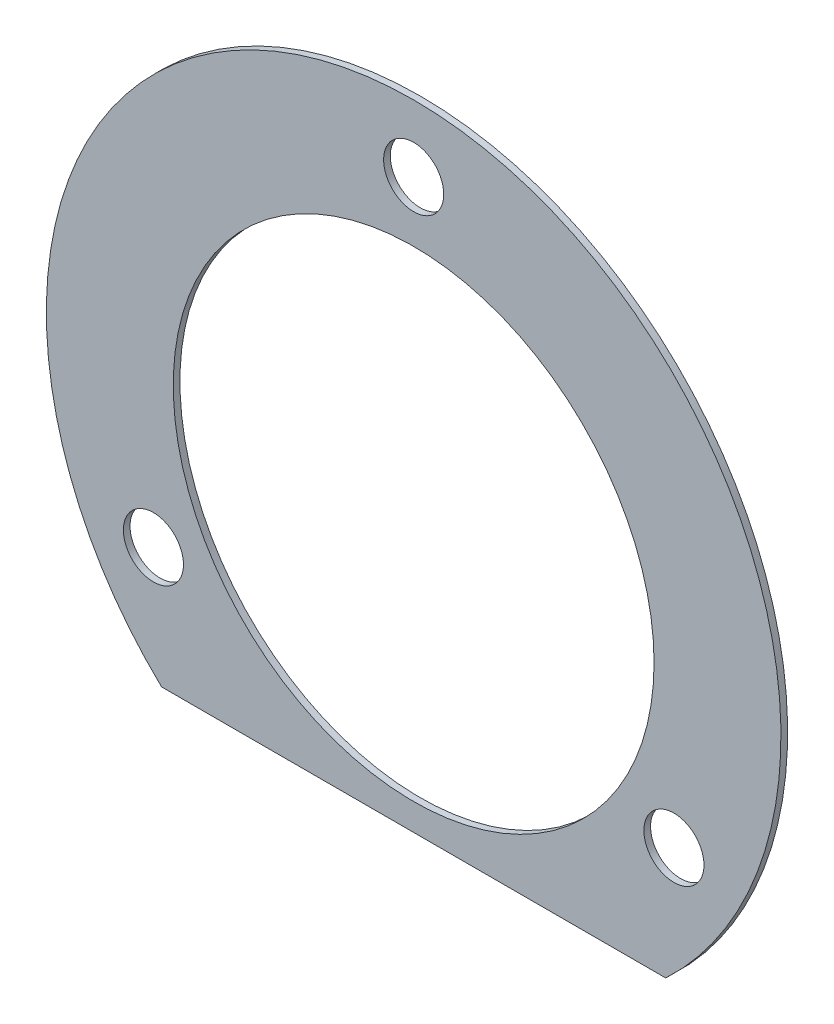
ISO-10303-21;
HEADER;
FILE_DESCRIPTION(('STEP AP214'),'2;1');
FILE_NAME('part.step','',(''),(''),'','','');
FILE_SCHEMA(('AUTOMOTIVE_DESIGN { 1 0 10303 214 1 1 1 1 }'));
ENDSEC;
DATA;
#1=APPLICATION_CONTEXT('core data for automotive mechanical design processes');
#2=APPLICATION_PROTOCOL_DEFINITION('international standard','automotive_design',2000,#1);
#3=PRODUCT_CONTEXT('',#1,'mechanical');
#4=PRODUCT('Part','Part','',(#3));
#5=PRODUCT_RELATED_PRODUCT_CATEGORY('part','',(#4));
#6=PRODUCT_DEFINITION_FORMATION('','',#4);
#7=PRODUCT_DEFINITION_CONTEXT('part definition',#1,'design');
#8=PRODUCT_DEFINITION('design','',#6,#7);
#9=PRODUCT_DEFINITION_SHAPE('','',#8);
#10=(LENGTH_UNIT() NAMED_UNIT(*) SI_UNIT(.MILLI.,.METRE.));
#11=(NAMED_UNIT(*) PLANE_ANGLE_UNIT() SI_UNIT($,.RADIAN.));
#12=(NAMED_UNIT(*) SI_UNIT($,.STERADIAN.) SOLID_ANGLE_UNIT());
#13=UNCERTAINTY_MEASURE_WITH_UNIT(LENGTH_MEASURE(1.E-05),#10,'distance_accuracy_value','');
#14=(GEOMETRIC_REPRESENTATION_CONTEXT(3) GLOBAL_UNCERTAINTY_ASSIGNED_CONTEXT((#13)) GLOBAL_UNIT_ASSIGNED_CONTEXT((#10,
#11,#12)) REPRESENTATION_CONTEXT('',''));
#15=CARTESIAN_POINT('',(0.,0.,0.));
#16=DIRECTION('',(0.,0.,1.));
#17=DIRECTION('',(1.,0.,0.));
#18=AXIS2_PLACEMENT_3D('',#15,#16,#17);
#19=CARTESIAN_POINT('',(0.,0.,1.));
#20=DIRECTION('',(0.,0.,1.));
#21=DIRECTION('',(1.,0.,0.));
#22=AXIS2_PLACEMENT_3D('',#19,#20,#21);
#23=PLANE('',#22);
#24=DIRECTION('',(1.,0.,0.));
#25=VECTOR('',#24,1.);
#26=CARTESIAN_POINT('',(37.7491721763537,-40.,1.));
#27=LINE('',#26,#25);
#28=CARTESIAN_POINT('',(-37.7491721763537,-40.,1.));
#29=VERTEX_POINT('',#28);
#30=CARTESIAN_POINT('',(37.7491721763537,-40.,1.));
#31=VERTEX_POINT('',#30);
#32=EDGE_CURVE('E56',#29,#31,#27,.T.);
#33=ORIENTED_EDGE('',*,*,#32,.T.);
#34=CARTESIAN_POINT('',(0.,0.,1.));
#35=DIRECTION('',(0.,0.,1.));
#36=DIRECTION('',(1.,0.,0.));
#37=AXIS2_PLACEMENT_3D('',#34,#35,#36);
#38=CIRCLE('',#37,55.);
#39=EDGE_CURVE('E12',#31,#29,#38,.T.);
#40=ORIENTED_EDGE('',*,*,#39,.T.);
#41=EDGE_LOOP('',(#33,#40));
#42=FACE_BOUND('',#41,.T.);
#43=CARTESIAN_POINT('',(0.,45.,1.));
#44=DIRECTION('',(0.,0.,1.));
#45=DIRECTION('',(1.,0.,0.));
#46=AXIS2_PLACEMENT_3D('',#43,#44,#45);
#47=CIRCLE('',#46,4.50000000000001);
#48=CARTESIAN_POINT('',(4.50000000000001,45.,1.));
#49=VERTEX_POINT('',#48);
#50=EDGE_CURVE('E109',#49,#49,#47,.T.);
#51=ORIENTED_EDGE('',*,*,#50,.F.);
#52=EDGE_LOOP('',(#51));
#53=FACE_BOUND('',#52,.T.);
#54=CARTESIAN_POINT('',(38.9711431702997,-22.4999999999983,1.));
#55=DIRECTION('',(0.,0.,1.));
#56=DIRECTION('',(1.,0.,0.));
#57=AXIS2_PLACEMENT_3D('',#54,#55,#56);
#58=CIRCLE('',#57,4.50000000000186);
#59=CARTESIAN_POINT('',(43.4711431703016,-22.4999999999983,1.));
#60=VERTEX_POINT('',#59);
#61=EDGE_CURVE('E101',#60,#60,#58,.T.);
#62=ORIENTED_EDGE('',*,*,#61,.F.);
#63=EDGE_LOOP('',(#62));
#64=FACE_BOUND('',#63,.T.);
#65=CARTESIAN_POINT('',(-38.9711431702983,-22.4999999999992,1.));
#66=DIRECTION('',(0.,0.,1.));
#67=DIRECTION('',(1.,0.,0.));
#68=AXIS2_PLACEMENT_3D('',#65,#66,#67);
#69=CIRCLE('',#68,4.50000000000094);
#70=CARTESIAN_POINT('',(-34.4711431702973,-22.4999999999992,1.));
#71=VERTEX_POINT('',#70);
#72=EDGE_CURVE('E72',#71,#71,#69,.T.);
#73=ORIENTED_EDGE('',*,*,#72,.F.);
#74=EDGE_LOOP('',(#73));
#75=FACE_BOUND('',#74,.T.);
#76=CARTESIAN_POINT('',(0.,0.,1.));
#77=DIRECTION('',(0.,0.,1.));
#78=DIRECTION('',(1.,0.,0.));
#79=AXIS2_PLACEMENT_3D('',#76,#77,#78);
#80=CIRCLE('',#79,36.);
#81=CARTESIAN_POINT('',(36.,0.,1.));
#82=VERTEX_POINT('',#81);
#83=EDGE_CURVE('E82',#82,#82,#80,.T.);
#84=ORIENTED_EDGE('',*,*,#83,.F.);
#85=EDGE_LOOP('',(#84));
#86=FACE_BOUND('',#85,.T.);
#87=ADVANCED_FACE('F40',(#42,#53,#64,#75,#86),#23,.T.);
#88=CARTESIAN_POINT('',(0.,0.,0.));
#89=DIRECTION('',(0.,0.,1.));
#90=DIRECTION('',(1.,0.,0.));
#91=AXIS2_PLACEMENT_3D('',#88,#89,#90);
#92=PLANE('',#91);
#93=CARTESIAN_POINT('',(0.,45.,0.));
#94=DIRECTION('',(0.,0.,1.));
#95=DIRECTION('',(1.,0.,0.));
#96=AXIS2_PLACEMENT_3D('',#93,#94,#95);
#97=CIRCLE('',#96,4.50000000000001);
#98=CARTESIAN_POINT('',(4.50000000000001,45.,0.));
#99=VERTEX_POINT('',#98);
#100=EDGE_CURVE('E91',#99,#99,#97,.T.);
#101=ORIENTED_EDGE('',*,*,#100,.T.);
#102=EDGE_LOOP('',(#101));
#103=FACE_BOUND('',#102,.T.);
#104=CARTESIAN_POINT('',(38.9711431702997,-22.4999999999983,0.));
#105=DIRECTION('',(0.,0.,1.));
#106=DIRECTION('',(1.,0.,0.));
#107=AXIS2_PLACEMENT_3D('',#104,#105,#106);
#108=CIRCLE('',#107,4.50000000000186);
#109=CARTESIAN_POINT('',(43.4711431703016,-22.4999999999983,0.));
#110=VERTEX_POINT('',#109);
#111=EDGE_CURVE('E105',#110,#110,#108,.T.);
#112=ORIENTED_EDGE('',*,*,#111,.T.);
#113=EDGE_LOOP('',(#112));
#114=FACE_BOUND('',#113,.T.);
#115=CARTESIAN_POINT('',(-38.9711431702983,-22.4999999999992,0.));
#116=DIRECTION('',(0.,0.,1.));
#117=DIRECTION('',(1.,0.,0.));
#118=AXIS2_PLACEMENT_3D('',#115,#116,#117);
#119=CIRCLE('',#118,4.50000000000094);
#120=CARTESIAN_POINT('',(-34.4711431702973,-22.4999999999992,0.));
#121=VERTEX_POINT('',#120);
#122=EDGE_CURVE('E97',#121,#121,#119,.T.);
#123=ORIENTED_EDGE('',*,*,#122,.T.);
#124=EDGE_LOOP('',(#123));
#125=FACE_BOUND('',#124,.T.);
#126=CARTESIAN_POINT('',(0.,0.,0.));
#127=DIRECTION('',(0.,0.,1.));
#128=DIRECTION('',(1.,0.,0.));
#129=AXIS2_PLACEMENT_3D('',#126,#127,#128);
#130=CIRCLE('',#129,55.);
#131=CARTESIAN_POINT('',(37.7491721763537,-40.,0.));
#132=VERTEX_POINT('',#131);
#133=CARTESIAN_POINT('',(-37.7491721763537,-40.,0.));
#134=VERTEX_POINT('',#133);
#135=EDGE_CURVE('E44',#132,#134,#130,.T.);
#136=ORIENTED_EDGE('',*,*,#135,.F.);
#137=DIRECTION('',(1.,0.,0.));
#138=VECTOR('',#137,1.);
#139=CARTESIAN_POINT('',(37.7491721763537,-40.,0.));
#140=LINE('',#139,#138);
#141=EDGE_CURVE('E61',#134,#132,#140,.T.);
#142=ORIENTED_EDGE('',*,*,#141,.F.);
#143=EDGE_LOOP('',(#136,#142));
#144=FACE_BOUND('',#143,.T.);
#145=CARTESIAN_POINT('',(0.,0.,0.));
#146=DIRECTION('',(0.,0.,1.));
#147=DIRECTION('',(1.,0.,0.));
#148=AXIS2_PLACEMENT_3D('',#145,#146,#147);
#149=CIRCLE('',#148,36.);
#150=CARTESIAN_POINT('',(36.,0.,0.));
#151=VERTEX_POINT('',#150);
#152=EDGE_CURVE('E85',#151,#151,#149,.T.);
#153=ORIENTED_EDGE('',*,*,#152,.T.);
#154=EDGE_LOOP('',(#153));
#155=FACE_BOUND('',#154,.T.);
#156=ADVANCED_FACE('F77',(#103,#114,#125,#144,#155),#92,.F.);
#157=CARTESIAN_POINT('',(0.,0.,1.));
#158=DIRECTION('',(0.,0.,-1.));
#159=DIRECTION('',(-1.,0.,0.));
#160=AXIS2_PLACEMENT_3D('',#157,#158,#159);
#161=CYLINDRICAL_SURFACE('',#160,55.);
#162=ORIENTED_EDGE('',*,*,#39,.F.);
#163=DIRECTION('',(0.,0.,-1.));
#164=VECTOR('',#163,1.);
#165=CARTESIAN_POINT('',(37.7491721763537,-40.,1.));
#166=LINE('',#165,#164);
#167=EDGE_CURVE('E73',#31,#132,#166,.T.);
#168=ORIENTED_EDGE('',*,*,#167,.T.);
#169=ORIENTED_EDGE('',*,*,#135,.T.);
#170=DIRECTION('',(0.,0.,-1.));
#171=VECTOR('',#170,1.);
#172=CARTESIAN_POINT('',(-37.7491721763537,-40.,1.));
#173=LINE('',#172,#171);
#174=EDGE_CURVE('E66',#29,#134,#173,.T.);
#175=ORIENTED_EDGE('',*,*,#174,.F.);
#176=EDGE_LOOP('',(#162,#168,#169,#175));
#177=FACE_BOUND('',#176,.T.);
#178=ADVANCED_FACE('F42',(#177),#161,.T.);
#179=CARTESIAN_POINT('',(0.,0.,1.));
#180=DIRECTION('',(0.,0.,-1.));
#181=DIRECTION('',(-1.,0.,0.));
#182=AXIS2_PLACEMENT_3D('',#179,#180,#181);
#183=CYLINDRICAL_SURFACE('',#182,36.);
#184=ORIENTED_EDGE('',*,*,#83,.T.);
#185=EDGE_LOOP('',(#184));
#186=FACE_BOUND('',#185,.T.);
#187=ORIENTED_EDGE('',*,*,#152,.F.);
#188=EDGE_LOOP('',(#187));
#189=FACE_BOUND('',#188,.T.);
#190=ADVANCED_FACE('F133',(#186,#189),#183,.F.);
#191=CARTESIAN_POINT('',(-38.9711431702983,-22.4999999999992,0.));
#192=DIRECTION('',(0.,0.,1.));
#193=DIRECTION('',(1.,0.,0.));
#194=AXIS2_PLACEMENT_3D('',#191,#192,#193);
#195=CYLINDRICAL_SURFACE('',#194,4.50000000000094);
#196=ORIENTED_EDGE('',*,*,#122,.F.);
#197=EDGE_LOOP('',(#196));
#198=FACE_BOUND('',#197,.T.);
#199=ORIENTED_EDGE('',*,*,#72,.T.);
#200=EDGE_LOOP('',(#199));
#201=FACE_BOUND('',#200,.T.);
#202=ADVANCED_FACE('F130',(#198,#201),#195,.F.);
#203=CARTESIAN_POINT('',(38.9711431702997,-22.4999999999983,0.));
#204=DIRECTION('',(0.,0.,1.));
#205=DIRECTION('',(1.,0.,0.));
#206=AXIS2_PLACEMENT_3D('',#203,#204,#205);
#207=CYLINDRICAL_SURFACE('',#206,4.50000000000186);
#208=ORIENTED_EDGE('',*,*,#111,.F.);
#209=EDGE_LOOP('',(#208));
#210=FACE_BOUND('',#209,.T.);
#211=ORIENTED_EDGE('',*,*,#61,.T.);
#212=EDGE_LOOP('',(#211));
#213=FACE_BOUND('',#212,.T.);
#214=ADVANCED_FACE('F132',(#210,#213),#207,.F.);
#215=CARTESIAN_POINT('',(0.,45.,0.));
#216=DIRECTION('',(0.,0.,1.));
#217=DIRECTION('',(1.,0.,0.));
#218=AXIS2_PLACEMENT_3D('',#215,#216,#217);
#219=CYLINDRICAL_SURFACE('',#218,4.50000000000001);
#220=ORIENTED_EDGE('',*,*,#100,.F.);
#221=EDGE_LOOP('',(#220));
#222=FACE_BOUND('',#221,.T.);
#223=ORIENTED_EDGE('',*,*,#50,.T.);
#224=EDGE_LOOP('',(#223));
#225=FACE_BOUND('',#224,.T.);
#226=ADVANCED_FACE('F140',(#222,#225),#219,.F.);
#227=CARTESIAN_POINT('',(37.7491721763537,-40.,1.));
#228=DIRECTION('',(0.,1.,0.));
#229=DIRECTION('',(0.,0.,1.));
#230=AXIS2_PLACEMENT_3D('',#227,#228,#229);
#231=PLANE('',#230);
#232=ORIENTED_EDGE('',*,*,#141,.T.);
#233=ORIENTED_EDGE('',*,*,#167,.F.);
#234=ORIENTED_EDGE('',*,*,#32,.F.);
#235=ORIENTED_EDGE('',*,*,#174,.T.);
#236=EDGE_LOOP('',(#232,#233,#234,#235));
#237=FACE_BOUND('',#236,.T.);
#238=ADVANCED_FACE('F67',(#237),#231,.F.);
#239=CLOSED_SHELL('',(#87,#156,#178,#190,#202,#214,#226,#238));
#240=MANIFOLD_SOLID_BREP('B2',#239);
#241=ADVANCED_BREP_SHAPE_REPRESENTATION('',(#18,#240),#14);
#242=SHAPE_DEFINITION_REPRESENTATION(#9,#241);
ENDSEC;
END-ISO-10303-21;
